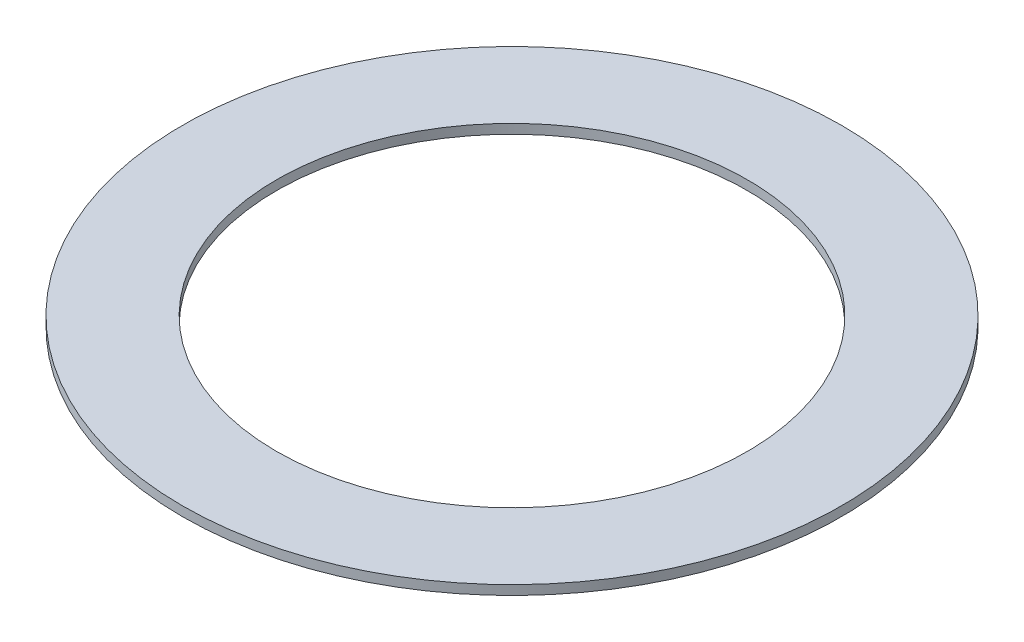
ISO-10303-21;
HEADER;
FILE_DESCRIPTION(('STEP AP214'),'2;1');
FILE_NAME('part.step','',(''),(''),'','','');
FILE_SCHEMA(('AUTOMOTIVE_DESIGN { 1 0 10303 214 1 1 1 1 }'));
ENDSEC;
DATA;
#1=APPLICATION_CONTEXT('core data for automotive mechanical design processes');
#2=APPLICATION_PROTOCOL_DEFINITION('international standard','automotive_design',2000,#1);
#3=PRODUCT_CONTEXT('',#1,'mechanical');
#4=PRODUCT('Part','Part','',(#3));
#5=PRODUCT_RELATED_PRODUCT_CATEGORY('part','',(#4));
#6=PRODUCT_DEFINITION_FORMATION('','',#4);
#7=PRODUCT_DEFINITION_CONTEXT('part definition',#1,'design');
#8=PRODUCT_DEFINITION('design','',#6,#7);
#9=PRODUCT_DEFINITION_SHAPE('','',#8);
#10=(LENGTH_UNIT() NAMED_UNIT(*) SI_UNIT(.MILLI.,.METRE.));
#11=(NAMED_UNIT(*) PLANE_ANGLE_UNIT() SI_UNIT($,.RADIAN.));
#12=(NAMED_UNIT(*) SI_UNIT($,.STERADIAN.) SOLID_ANGLE_UNIT());
#13=UNCERTAINTY_MEASURE_WITH_UNIT(LENGTH_MEASURE(1.E-05),#10,'distance_accuracy_value','');
#14=(GEOMETRIC_REPRESENTATION_CONTEXT(3) GLOBAL_UNCERTAINTY_ASSIGNED_CONTEXT((#13)) GLOBAL_UNIT_ASSIGNED_CONTEXT((#10,
#11,#12)) REPRESENTATION_CONTEXT('',''));
#15=CARTESIAN_POINT('',(0.,0.,0.));
#16=DIRECTION('',(0.,0.,1.));
#17=DIRECTION('',(1.,0.,0.));
#18=AXIS2_PLACEMENT_3D('',#15,#16,#17);
#19=CARTESIAN_POINT('',(0.,0.5,0.));
#20=DIRECTION('',(0.,1.,0.));
#21=DIRECTION('',(0.,0.,1.));
#22=AXIS2_PLACEMENT_3D('',#19,#20,#21);
#23=PLANE('',#22);
#24=CARTESIAN_POINT('',(0.,0.5,0.));
#25=DIRECTION('',(0.,1.,0.));
#26=DIRECTION('',(0.,0.,1.));
#27=AXIS2_PLACEMENT_3D('',#24,#25,#26);
#28=CIRCLE('',#27,17.5);
#29=CARTESIAN_POINT('',(0.,0.5,17.5));
#30=VERTEX_POINT('',#29);
#31=EDGE_CURVE('E10',#30,#30,#28,.T.);
#32=ORIENTED_EDGE('',*,*,#31,.T.);
#33=EDGE_LOOP('',(#32));
#34=FACE_BOUND('',#33,.T.);
#35=CARTESIAN_POINT('',(0.,0.5,0.));
#36=DIRECTION('',(0.,1.,0.));
#37=DIRECTION('',(0.,0.,1.));
#38=AXIS2_PLACEMENT_3D('',#35,#36,#37);
#39=CIRCLE('',#38,12.5);
#40=CARTESIAN_POINT('',(0.,0.5,12.5));
#41=VERTEX_POINT('',#40);
#42=EDGE_CURVE('E45',#41,#41,#39,.T.);
#43=ORIENTED_EDGE('',*,*,#42,.F.);
#44=EDGE_LOOP('',(#43));
#45=FACE_BOUND('',#44,.T.);
#46=ADVANCED_FACE('F34',(#34,#45),#23,.T.);
#47=CARTESIAN_POINT('',(0.,0.,0.));
#48=DIRECTION('',(0.,1.,0.));
#49=DIRECTION('',(0.,0.,1.));
#50=AXIS2_PLACEMENT_3D('',#47,#48,#49);
#51=PLANE('',#50);
#52=CARTESIAN_POINT('',(0.,0.,0.));
#53=DIRECTION('',(0.,1.,0.));
#54=DIRECTION('',(0.,0.,1.));
#55=AXIS2_PLACEMENT_3D('',#52,#53,#54);
#56=CIRCLE('',#55,17.5);
#57=CARTESIAN_POINT('',(0.,0.,17.5));
#58=VERTEX_POINT('',#57);
#59=EDGE_CURVE('E38',#58,#58,#56,.T.);
#60=ORIENTED_EDGE('',*,*,#59,.F.);
#61=EDGE_LOOP('',(#60));
#62=FACE_BOUND('',#61,.T.);
#63=CARTESIAN_POINT('',(0.,0.,0.));
#64=DIRECTION('',(0.,1.,0.));
#65=DIRECTION('',(0.,0.,1.));
#66=AXIS2_PLACEMENT_3D('',#63,#64,#65);
#67=CIRCLE('',#66,12.5);
#68=CARTESIAN_POINT('',(0.,0.,12.5));
#69=VERTEX_POINT('',#68);
#70=EDGE_CURVE('E47',#69,#69,#67,.T.);
#71=ORIENTED_EDGE('',*,*,#70,.T.);
#72=EDGE_LOOP('',(#71));
#73=FACE_BOUND('',#72,.T.);
#74=ADVANCED_FACE('F57',(#62,#73),#51,.F.);
#75=CARTESIAN_POINT('',(0.,0.5,0.));
#76=DIRECTION('',(0.,-1.,0.));
#77=DIRECTION('',(0.,0.,-1.));
#78=AXIS2_PLACEMENT_3D('',#75,#76,#77);
#79=CYLINDRICAL_SURFACE('',#78,17.5);
#80=ORIENTED_EDGE('',*,*,#31,.F.);
#81=EDGE_LOOP('',(#80));
#82=FACE_BOUND('',#81,.T.);
#83=ORIENTED_EDGE('',*,*,#59,.T.);
#84=EDGE_LOOP('',(#83));
#85=FACE_BOUND('',#84,.T.);
#86=ADVANCED_FACE('F36',(#82,#85),#79,.T.);
#87=CARTESIAN_POINT('',(0.,0.5,0.));
#88=DIRECTION('',(0.,-1.,0.));
#89=DIRECTION('',(0.,0.,-1.));
#90=AXIS2_PLACEMENT_3D('',#87,#88,#89);
#91=CYLINDRICAL_SURFACE('',#90,12.5);
#92=ORIENTED_EDGE('',*,*,#42,.T.);
#93=EDGE_LOOP('',(#92));
#94=FACE_BOUND('',#93,.T.);
#95=ORIENTED_EDGE('',*,*,#70,.F.);
#96=EDGE_LOOP('',(#95));
#97=FACE_BOUND('',#96,.T.);
#98=ADVANCED_FACE('F53',(#94,#97),#91,.F.);
#99=CLOSED_SHELL('',(#46,#74,#86,#98));
#100=MANIFOLD_SOLID_BREP('B2',#99);
#101=ADVANCED_BREP_SHAPE_REPRESENTATION('',(#18,#100),#14);
#102=SHAPE_DEFINITION_REPRESENTATION(#9,#101);
ENDSEC;
END-ISO-10303-21;
